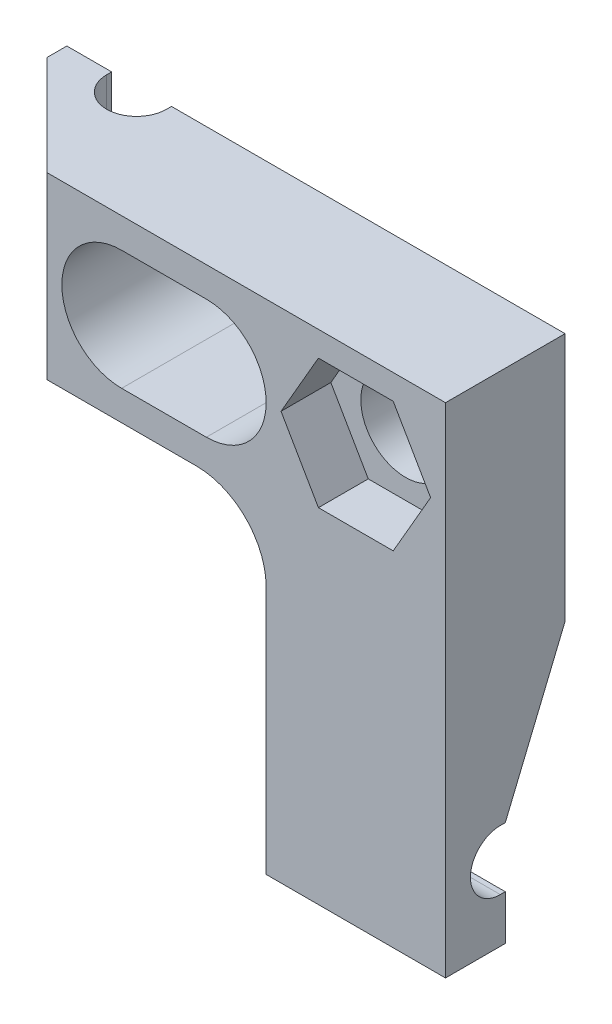
ISO-10303-21;
HEADER;
FILE_DESCRIPTION(('STEP AP214'),'2;1');
FILE_NAME('part.step','',(''),(''),'','','');
FILE_SCHEMA(('AUTOMOTIVE_DESIGN { 1 0 10303 214 1 1 1 1 }'));
ENDSEC;
DATA;
#1=APPLICATION_CONTEXT('core data for automotive mechanical design processes');
#2=APPLICATION_PROTOCOL_DEFINITION('international standard','automotive_design',2000,#1);
#3=PRODUCT_CONTEXT('',#1,'mechanical');
#4=PRODUCT('Part','Part','',(#3));
#5=PRODUCT_RELATED_PRODUCT_CATEGORY('part','',(#4));
#6=PRODUCT_DEFINITION_FORMATION('','',#4);
#7=PRODUCT_DEFINITION_CONTEXT('part definition',#1,'design');
#8=PRODUCT_DEFINITION('design','',#6,#7);
#9=PRODUCT_DEFINITION_SHAPE('','',#8);
#10=(LENGTH_UNIT() NAMED_UNIT(*) SI_UNIT(.MILLI.,.METRE.));
#11=(NAMED_UNIT(*) PLANE_ANGLE_UNIT() SI_UNIT($,.RADIAN.));
#12=(NAMED_UNIT(*) SI_UNIT($,.STERADIAN.) SOLID_ANGLE_UNIT());
#13=UNCERTAINTY_MEASURE_WITH_UNIT(LENGTH_MEASURE(1.E-05),#10,'distance_accuracy_value','');
#14=(GEOMETRIC_REPRESENTATION_CONTEXT(3) GLOBAL_UNCERTAINTY_ASSIGNED_CONTEXT((#13)) GLOBAL_UNIT_ASSIGNED_CONTEXT((#10,
#11,#12)) REPRESENTATION_CONTEXT('',''));
#15=CARTESIAN_POINT('',(0.,0.,0.));
#16=DIRECTION('',(0.,0.,1.));
#17=DIRECTION('',(1.,0.,0.));
#18=AXIS2_PLACEMENT_3D('',#15,#16,#17);
#19=CARTESIAN_POINT('',(42.5,17.5,6.));
#20=DIRECTION('',(0.,0.,1.));
#21=DIRECTION('',(1.,0.,0.));
#22=AXIS2_PLACEMENT_3D('',#19,#20,#21);
#23=PLANE('',#22);
#24=DIRECTION('',(-1.,0.,0.));
#25=VECTOR('',#24,1.);
#26=CARTESIAN_POINT('',(42.5,3.,6.));
#27=LINE('',#26,#25);
#28=CARTESIAN_POINT('',(39.5,3.,6.));
#29=VERTEX_POINT('',#28);
#30=CARTESIAN_POINT('',(27.5,3.,6.));
#31=VERTEX_POINT('',#30);
#32=EDGE_CURVE('E303',#29,#31,#27,.T.);
#33=ORIENTED_EDGE('',*,*,#32,.T.);
#34=DIRECTION('',(0.,1.,0.));
#35=VECTOR('',#34,1.);
#36=CARTESIAN_POINT('',(27.5,3.,6.));
#37=LINE('',#36,#35);
#38=CARTESIAN_POINT('',(27.5,17.5,6.));
#39=VERTEX_POINT('',#38);
#40=EDGE_CURVE('E270',#31,#39,#37,.T.);
#41=ORIENTED_EDGE('',*,*,#40,.T.);
#42=DIRECTION('',(1.,0.,0.));
#43=VECTOR('',#42,1.);
#44=CARTESIAN_POINT('',(42.5,17.5,6.));
#45=LINE('',#44,#43);
#46=CARTESIAN_POINT('',(39.5,17.5,6.));
#47=VERTEX_POINT('',#46);
#48=EDGE_CURVE('E301',#39,#47,#45,.T.);
#49=ORIENTED_EDGE('',*,*,#48,.T.);
#50=DIRECTION('',(0.,-1.,0.));
#51=VECTOR('',#50,1.);
#52=CARTESIAN_POINT('',(39.5,3.,6.));
#53=LINE('',#52,#51);
#54=EDGE_CURVE('E286',#47,#29,#53,.T.);
#55=ORIENTED_EDGE('',*,*,#54,.T.);
#56=EDGE_LOOP('',(#33,#41,#49,#55));
#57=FACE_BOUND('',#56,.T.);
#58=ADVANCED_FACE('F31',(#57),#23,.F.);
#59=CARTESIAN_POINT('',(42.5,17.5,6.));
#60=DIRECTION('',(0.,1.,0.));
#61=DIRECTION('',(0.,0.,1.));
#62=AXIS2_PLACEMENT_3D('',#59,#60,#61);
#63=PLANE('',#62);
#64=ORIENTED_EDGE('',*,*,#48,.F.);
#65=DIRECTION('',(0.,0.,-1.));
#66=VECTOR('',#65,1.);
#67=CARTESIAN_POINT('',(27.5,17.5,6.));
#68=LINE('',#67,#66);
#69=CARTESIAN_POINT('',(27.5,17.5,0.));
#70=VERTEX_POINT('',#69);
#71=EDGE_CURVE('E272',#39,#70,#68,.T.);
#72=ORIENTED_EDGE('',*,*,#71,.T.);
#73=DIRECTION('',(1.,0.,0.));
#74=VECTOR('',#73,1.);
#75=CARTESIAN_POINT('',(42.5,17.5,0.));
#76=LINE('',#75,#74);
#77=CARTESIAN_POINT('',(39.5,17.5,0.));
#78=VERTEX_POINT('',#77);
#79=EDGE_CURVE('E293',#70,#78,#76,.T.);
#80=ORIENTED_EDGE('',*,*,#79,.T.);
#81=DIRECTION('',(0.,0.,1.));
#82=VECTOR('',#81,1.);
#83=CARTESIAN_POINT('',(39.5,17.5,6.));
#84=LINE('',#83,#82);
#85=EDGE_CURVE('E283',#78,#47,#84,.T.);
#86=ORIENTED_EDGE('',*,*,#85,.T.);
#87=EDGE_LOOP('',(#64,#72,#80,#86));
#88=FACE_BOUND('',#87,.T.);
#89=ADVANCED_FACE('F501',(#88),#63,.F.);
#90=CARTESIAN_POINT('',(17.5,17.5,0.));
#91=DIRECTION('',(0.,0.,-1.));
#92=DIRECTION('',(-1.,0.,0.));
#93=AXIS2_PLACEMENT_3D('',#90,#91,#92);
#94=PLANE('',#93);
#95=CARTESIAN_POINT('',(18.5,33.5,0.));
#96=DIRECTION('',(0.,0.,-1.));
#97=DIRECTION('',(-1.,0.,0.));
#98=AXIS2_PLACEMENT_3D('',#95,#96,#97);
#99=CIRCLE('',#98,6.);
#100=CARTESIAN_POINT('',(18.5,39.5,0.));
#101=VERTEX_POINT('',#100);
#102=CARTESIAN_POINT('',(18.5,27.5,0.));
#103=VERTEX_POINT('',#102);
#104=EDGE_CURVE('E230',#101,#103,#99,.T.);
#105=ORIENTED_EDGE('',*,*,#104,.F.);
#106=DIRECTION('',(1.,0.,0.));
#107=VECTOR('',#106,1.);
#108=CARTESIAN_POINT('',(18.5,39.5,0.));
#109=LINE('',#108,#107);
#110=CARTESIAN_POINT('',(10.,39.5,0.));
#111=VERTEX_POINT('',#110);
#112=EDGE_CURVE('E248',#111,#101,#109,.T.);
#113=ORIENTED_EDGE('',*,*,#112,.F.);
#114=CARTESIAN_POINT('',(10.,33.5,0.));
#115=DIRECTION('',(0.,0.,-1.));
#116=DIRECTION('',(-1.,0.,0.));
#117=AXIS2_PLACEMENT_3D('',#114,#115,#116);
#118=CIRCLE('',#117,5.99999999999999);
#119=CARTESIAN_POINT('',(10.,27.5,0.));
#120=VERTEX_POINT('',#119);
#121=EDGE_CURVE('E251',#120,#111,#118,.T.);
#122=ORIENTED_EDGE('',*,*,#121,.F.);
#123=DIRECTION('',(-1.,0.,0.));
#124=VECTOR('',#123,1.);
#125=CARTESIAN_POINT('',(18.5,27.5,0.));
#126=LINE('',#125,#124);
#127=EDGE_CURVE('E257',#103,#120,#126,.T.);
#128=ORIENTED_EDGE('',*,*,#127,.F.);
#129=EDGE_LOOP('',(#105,#113,#122,#128));
#130=FACE_BOUND('',#129,.T.);
#131=CARTESIAN_POINT('',(24.5,17.5,0.));
#132=VERTEX_POINT('',#131);
#133=EDGE_CURVE('E297',#132,#70,#76,.T.);
#134=ORIENTED_EDGE('',*,*,#133,.F.);
#135=CARTESIAN_POINT('',(17.5,17.5,0.));
#136=DIRECTION('',(0.,0.,-1.));
#137=DIRECTION('',(-1.,0.,0.));
#138=AXIS2_PLACEMENT_3D('',#135,#136,#137);
#139=CIRCLE('',#138,6.99999999999999);
#140=CARTESIAN_POINT('',(17.5,24.5,0.));
#141=VERTEX_POINT('',#140);
#142=EDGE_CURVE('E424',#141,#132,#139,.T.);
#143=ORIENTED_EDGE('',*,*,#142,.F.);
#144=DIRECTION('',(1.,0.,0.));
#145=VECTOR('',#144,1.);
#146=CARTESIAN_POINT('',(-7.5,24.5,0.));
#147=LINE('',#146,#145);
#148=CARTESIAN_POINT('',(3.,24.5,0.));
#149=VERTEX_POINT('',#148);
#150=EDGE_CURVE('E420',#149,#141,#147,.T.);
#151=ORIENTED_EDGE('',*,*,#150,.F.);
#152=DIRECTION('',(0.,1.,0.));
#153=VECTOR('',#152,1.);
#154=CARTESIAN_POINT('',(3.,17.5,0.));
#155=LINE('',#154,#153);
#156=CARTESIAN_POINT('',(3.,42.5,0.));
#157=VERTEX_POINT('',#156);
#158=EDGE_CURVE('E340',#149,#157,#155,.T.);
#159=ORIENTED_EDGE('',*,*,#158,.T.);
#160=DIRECTION('',(-1.,0.,0.));
#161=VECTOR('',#160,1.);
#162=CARTESIAN_POINT('',(-7.5,42.5,0.));
#163=LINE('',#162,#161);
#164=CARTESIAN_POINT('',(42.5,42.5,0.));
#165=VERTEX_POINT('',#164);
#166=EDGE_CURVE('E414',#165,#157,#163,.T.);
#167=ORIENTED_EDGE('',*,*,#166,.F.);
#168=DIRECTION('',(0.,1.,0.));
#169=VECTOR('',#168,1.);
#170=CARTESIAN_POINT('',(42.5,-7.50000000000001,0.));
#171=LINE('',#170,#169);
#172=CARTESIAN_POINT('',(42.5,17.5,0.));
#173=VERTEX_POINT('',#172);
#174=EDGE_CURVE('E403',#173,#165,#171,.T.);
#175=ORIENTED_EDGE('',*,*,#174,.F.);
#176=DIRECTION('',(1.,0.,0.));
#177=VECTOR('',#176,1.);
#178=CARTESIAN_POINT('',(39.5,17.5,0.));
#179=LINE('',#178,#177);
#180=EDGE_CURVE('E289',#78,#173,#179,.T.);
#181=ORIENTED_EDGE('',*,*,#180,.F.);
#182=ORIENTED_EDGE('',*,*,#79,.F.);
#183=EDGE_LOOP('',(#134,#143,#151,#159,#167,#175,#181,#182));
#184=FACE_BOUND('',#183,.T.);
#185=CARTESIAN_POINT('',(33.5,33.5,0.));
#186=DIRECTION('',(0.,0.,1.));
#187=DIRECTION('',(1.,0.,0.));
#188=AXIS2_PLACEMENT_3D('',#185,#186,#187);
#189=CIRCLE('',#188,4.5);
#190=CARTESIAN_POINT('',(38.,33.5,0.));
#191=VERTEX_POINT('',#190);
#192=EDGE_CURVE('E395',#191,#191,#189,.T.);
#193=ORIENTED_EDGE('',*,*,#192,.T.);
#194=EDGE_LOOP('',(#193));
#195=FACE_BOUND('',#194,.T.);
#196=ADVANCED_FACE('F508',(#130,#184,#195),#94,.T.);
#197=CARTESIAN_POINT('',(24.5,17.5,12.));
#198=DIRECTION('',(1.,0.,0.));
#199=DIRECTION('',(0.,1.,0.));
#200=AXIS2_PLACEMENT_3D('',#197,#198,#199);
#201=PLANE('',#200);
#202=DIRECTION('',(0.,0.,-1.));
#203=VECTOR('',#202,1.);
#204=CARTESIAN_POINT('',(24.5,17.5,12.));
#205=LINE('',#204,#203);
#206=CARTESIAN_POINT('',(24.5,17.5,12.));
#207=VERTEX_POINT('',#206);
#208=EDGE_CURVE('E436',#207,#132,#205,.T.);
#209=ORIENTED_EDGE('',*,*,#208,.T.);
#210=DIRECTION('',(0.,-0.924016832421891,0.3823517927263));
#211=VECTOR('',#210,1.);
#212=CARTESIAN_POINT('',(24.5,17.5,0.));
#213=LINE('',#212,#211);
#214=CARTESIAN_POINT('',(24.5,3.,6.));
#215=VERTEX_POINT('',#214);
#216=EDGE_CURVE('E263',#132,#215,#213,.T.);
#217=ORIENTED_EDGE('',*,*,#216,.T.);
#218=DIRECTION('',(0.,0.,-1.));
#219=VECTOR('',#218,1.);
#220=CARTESIAN_POINT('',(24.5,3.,12.));
#221=LINE('',#220,#219);
#222=CARTESIAN_POINT('',(24.5,3.,6.5));
#223=VERTEX_POINT('',#222);
#224=EDGE_CURVE('E326',#223,#215,#221,.T.);
#225=ORIENTED_EDGE('',*,*,#224,.F.);
#226=CARTESIAN_POINT('',(24.5,0.,6.5));
#227=DIRECTION('',(1.,0.,0.));
#228=DIRECTION('',(0.,1.,0.));
#229=AXIS2_PLACEMENT_3D('',#226,#227,#228);
#230=CIRCLE('',#229,3.);
#231=CARTESIAN_POINT('',(24.5,-3.,6.5));
#232=VERTEX_POINT('',#231);
#233=EDGE_CURVE('E324',#232,#223,#230,.F.);
#234=ORIENTED_EDGE('',*,*,#233,.F.);
#235=DIRECTION('',(0.,0.,1.));
#236=VECTOR('',#235,1.);
#237=CARTESIAN_POINT('',(24.5,-3.,12.));
#238=LINE('',#237,#236);
#239=CARTESIAN_POINT('',(24.5,-3.,6.));
#240=VERTEX_POINT('',#239);
#241=EDGE_CURVE('E322',#240,#232,#238,.T.);
#242=ORIENTED_EDGE('',*,*,#241,.F.);
#243=DIRECTION('',(0.,1.,0.));
#244=VECTOR('',#243,1.);
#245=CARTESIAN_POINT('',(24.5,-7.50000000000001,6.));
#246=LINE('',#245,#244);
#247=CARTESIAN_POINT('',(24.5,-7.50000000000001,6.));
#248=VERTEX_POINT('',#247);
#249=EDGE_CURVE('E299',#248,#240,#246,.T.);
#250=ORIENTED_EDGE('',*,*,#249,.F.);
#251=DIRECTION('',(0.,0.,-1.));
#252=VECTOR('',#251,1.);
#253=CARTESIAN_POINT('',(24.5,-7.50000000000001,12.));
#254=LINE('',#253,#252);
#255=CARTESIAN_POINT('',(24.5,-7.50000000000001,12.));
#256=VERTEX_POINT('',#255);
#257=EDGE_CURVE('E433',#256,#248,#254,.T.);
#258=ORIENTED_EDGE('',*,*,#257,.F.);
#259=DIRECTION('',(0.,-1.,0.));
#260=VECTOR('',#259,1.);
#261=CARTESIAN_POINT('',(24.5,17.5,12.));
#262=LINE('',#261,#260);
#263=EDGE_CURVE('E407',#207,#256,#262,.T.);
#264=ORIENTED_EDGE('',*,*,#263,.F.);
#265=EDGE_LOOP('',(#209,#217,#225,#234,#242,#250,#258,#264));
#266=FACE_BOUND('',#265,.T.);
#267=ADVANCED_FACE('F478',(#266),#201,.F.);
#268=CARTESIAN_POINT('',(42.5,-7.50000000000001,12.));
#269=DIRECTION('',(-1.,0.,0.));
#270=DIRECTION('',(0.,-1.,0.));
#271=AXIS2_PLACEMENT_3D('',#268,#269,#270);
#272=PLANE('',#271);
#273=DIRECTION('',(0.,0.,1.));
#274=VECTOR('',#273,1.);
#275=CARTESIAN_POINT('',(42.5,3.,0.500000000000001));
#276=LINE('',#275,#274);
#277=CARTESIAN_POINT('',(42.5,3.,6.));
#278=VERTEX_POINT('',#277);
#279=CARTESIAN_POINT('',(42.5,3.,6.5));
#280=VERTEX_POINT('',#279);
#281=EDGE_CURVE('E308',#278,#280,#276,.T.);
#282=ORIENTED_EDGE('',*,*,#281,.F.);
#283=DIRECTION('',(0.,0.924016832421891,-0.3823517927263));
#284=VECTOR('',#283,1.);
#285=CARTESIAN_POINT('',(42.5,17.5,0.));
#286=LINE('',#285,#284);
#287=EDGE_CURVE('E279',#278,#173,#286,.T.);
#288=ORIENTED_EDGE('',*,*,#287,.T.);
#289=ORIENTED_EDGE('',*,*,#174,.T.);
#290=DIRECTION('',(0.,0.,-1.));
#291=VECTOR('',#290,1.);
#292=CARTESIAN_POINT('',(42.5,42.5,12.));
#293=LINE('',#292,#291);
#294=CARTESIAN_POINT('',(42.5,42.5,12.));
#295=VERTEX_POINT('',#294);
#296=EDGE_CURVE('E413',#295,#165,#293,.T.);
#297=ORIENTED_EDGE('',*,*,#296,.F.);
#298=DIRECTION('',(0.,1.,0.));
#299=VECTOR('',#298,1.);
#300=CARTESIAN_POINT('',(42.5,-7.50000000000001,12.));
#301=LINE('',#300,#299);
#302=CARTESIAN_POINT('',(42.5,-7.50000000000001,12.));
#303=VERTEX_POINT('',#302);
#304=EDGE_CURVE('E411',#303,#295,#301,.T.);
#305=ORIENTED_EDGE('',*,*,#304,.F.);
#306=DIRECTION('',(0.,0.,-1.));
#307=VECTOR('',#306,1.);
#308=CARTESIAN_POINT('',(42.5,-7.50000000000001,12.));
#309=LINE('',#308,#307);
#310=CARTESIAN_POINT('',(42.5,-7.50000000000001,6.));
#311=VERTEX_POINT('',#310);
#312=EDGE_CURVE('E430',#303,#311,#309,.T.);
#313=ORIENTED_EDGE('',*,*,#312,.T.);
#314=DIRECTION('',(0.,-1.,0.));
#315=VECTOR('',#314,1.);
#316=CARTESIAN_POINT('',(42.5,-7.50000000000001,6.));
#317=LINE('',#316,#315);
#318=CARTESIAN_POINT('',(42.5,-3.,6.));
#319=VERTEX_POINT('',#318);
#320=EDGE_CURVE('E294',#319,#311,#317,.T.);
#321=ORIENTED_EDGE('',*,*,#320,.F.);
#322=DIRECTION('',(0.,0.,-1.));
#323=VECTOR('',#322,1.);
#324=CARTESIAN_POINT('',(42.5,-3.,0.5));
#325=LINE('',#324,#323);
#326=CARTESIAN_POINT('',(42.5,-3.,6.5));
#327=VERTEX_POINT('',#326);
#328=EDGE_CURVE('E313',#327,#319,#325,.T.);
#329=ORIENTED_EDGE('',*,*,#328,.F.);
#330=CARTESIAN_POINT('',(42.5,0.,6.5));
#331=DIRECTION('',(1.,0.,0.));
#332=DIRECTION('',(0.,0.,-1.));
#333=AXIS2_PLACEMENT_3D('',#330,#331,#332);
#334=CIRCLE('',#333,3.);
#335=EDGE_CURVE('E310',#280,#327,#334,.T.);
#336=ORIENTED_EDGE('',*,*,#335,.F.);
#337=EDGE_LOOP('',(#282,#288,#289,#297,#305,#313,#321,#329,#336));
#338=FACE_BOUND('',#337,.T.);
#339=ADVANCED_FACE('F488',(#338),#272,.F.);
#340=CARTESIAN_POINT('',(-3.,42.5,0.));
#341=VERTEX_POINT('',#340);
#342=CARTESIAN_POINT('',(-7.5,42.5,0.));
#343=VERTEX_POINT('',#342);
#344=EDGE_CURVE('E398',#341,#343,#163,.T.);
#345=ORIENTED_EDGE('',*,*,#344,.F.);
#346=DIRECTION('',(0.,-1.,0.));
#347=VECTOR('',#346,1.);
#348=CARTESIAN_POINT('',(-3.,17.5,0.));
#349=LINE('',#348,#347);
#350=CARTESIAN_POINT('',(-3.,24.5,0.));
#351=VERTEX_POINT('',#350);
#352=EDGE_CURVE('E343',#341,#351,#349,.T.);
#353=ORIENTED_EDGE('',*,*,#352,.T.);
#354=CARTESIAN_POINT('',(-7.5,24.5,0.));
#355=VERTEX_POINT('',#354);
#356=EDGE_CURVE('E421',#355,#351,#147,.T.);
#357=ORIENTED_EDGE('',*,*,#356,.F.);
#358=DIRECTION('',(0.,-1.,0.));
#359=VECTOR('',#358,1.);
#360=CARTESIAN_POINT('',(-7.5,42.5,0.));
#361=LINE('',#360,#359);
#362=EDGE_CURVE('E417',#343,#355,#361,.T.);
#363=ORIENTED_EDGE('',*,*,#362,.F.);
#364=EDGE_LOOP('',(#345,#353,#357,#363));
#365=FACE_BOUND('',#364,.T.);
#366=ADVANCED_FACE('F571',(#365),#94,.T.);
#367=CARTESIAN_POINT('',(-7.5,42.5,12.));
#368=DIRECTION('',(0.,-1.,0.));
#369=DIRECTION('',(0.,0.,-1.));
#370=AXIS2_PLACEMENT_3D('',#367,#368,#369);
#371=PLANE('',#370);
#372=DIRECTION('',(0.,0.,-1.));
#373=VECTOR('',#372,1.);
#374=CARTESIAN_POINT('',(-7.5,42.5,12.));
#375=LINE('',#374,#373);
#376=CARTESIAN_POINT('',(-7.5,42.5,1.99999999999997));
#377=VERTEX_POINT('',#376);
#378=EDGE_CURVE('E443',#377,#343,#375,.T.);
#379=ORIENTED_EDGE('',*,*,#378,.F.);
#380=DIRECTION('',(-0.707106781186546,0.,-0.707106781186549));
#381=VECTOR('',#380,1.);
#382=CARTESIAN_POINT('',(2.49999999999999,42.5,12.));
#383=LINE('',#382,#381);
#384=CARTESIAN_POINT('',(2.49999999999999,42.5,12.));
#385=VERTEX_POINT('',#384);
#386=EDGE_CURVE('E11',#377,#385,#383,.F.);
#387=ORIENTED_EDGE('',*,*,#386,.T.);
#388=DIRECTION('',(-1.,0.,0.));
#389=VECTOR('',#388,1.);
#390=CARTESIAN_POINT('',(-7.5,42.5,12.));
#391=LINE('',#390,#389);
#392=EDGE_CURVE('E399',#295,#385,#391,.T.);
#393=ORIENTED_EDGE('',*,*,#392,.F.);
#394=ORIENTED_EDGE('',*,*,#296,.T.);
#395=ORIENTED_EDGE('',*,*,#166,.T.);
#396=DIRECTION('',(0.,0.,-1.));
#397=VECTOR('',#396,1.);
#398=CARTESIAN_POINT('',(3.,42.5,-4.57695125411553));
#399=LINE('',#398,#397);
#400=CARTESIAN_POINT('',(3.,42.5,0.5));
#401=VERTEX_POINT('',#400);
#402=EDGE_CURVE('E332',#401,#157,#399,.T.);
#403=ORIENTED_EDGE('',*,*,#402,.F.);
#404=CARTESIAN_POINT('',(0.,42.5,0.5));
#405=DIRECTION('',(0.,1.,0.));
#406=DIRECTION('',(0.,0.,1.));
#407=AXIS2_PLACEMENT_3D('',#404,#405,#406);
#408=CIRCLE('',#407,3.);
#409=CARTESIAN_POINT('',(-3.,42.5,0.499999999999999));
#410=VERTEX_POINT('',#409);
#411=EDGE_CURVE('E330',#410,#401,#408,.T.);
#412=ORIENTED_EDGE('',*,*,#411,.F.);
#413=DIRECTION('',(0.,0.,1.));
#414=VECTOR('',#413,1.);
#415=CARTESIAN_POINT('',(-3.,42.5,-4.57695125411553));
#416=LINE('',#415,#414);
#417=EDGE_CURVE('E328',#341,#410,#416,.T.);
#418=ORIENTED_EDGE('',*,*,#417,.F.);
#419=ORIENTED_EDGE('',*,*,#344,.T.);
#420=EDGE_LOOP('',(#379,#387,#393,#394,#395,#403,#412,#418,#419));
#421=FACE_BOUND('',#420,.T.);
#422=ADVANCED_FACE('F492',(#421),#371,.F.);
#423=CARTESIAN_POINT('',(-7.5,24.5,12.));
#424=DIRECTION('',(0.,1.,0.));
#425=DIRECTION('',(0.,0.,1.));
#426=AXIS2_PLACEMENT_3D('',#423,#424,#425);
#427=PLANE('',#426);
#428=DIRECTION('',(1.,0.,0.));
#429=VECTOR('',#428,1.);
#430=CARTESIAN_POINT('',(-7.5,24.5,12.));
#431=LINE('',#430,#429);
#432=CARTESIAN_POINT('',(2.49999999999999,24.5,12.));
#433=VERTEX_POINT('',#432);
#434=CARTESIAN_POINT('',(17.5,24.5,12.));
#435=VERTEX_POINT('',#434);
#436=EDGE_CURVE('E402',#433,#435,#431,.T.);
#437=ORIENTED_EDGE('',*,*,#436,.F.);
#438=DIRECTION('',(0.707106781186546,0.,0.707106781186549));
#439=VECTOR('',#438,1.);
#440=CARTESIAN_POINT('',(2.49999999999999,24.5,12.));
#441=LINE('',#440,#439);
#442=CARTESIAN_POINT('',(-7.5,24.5,1.99999999999998));
#443=VERTEX_POINT('',#442);
#444=EDGE_CURVE('E53',#433,#443,#441,.F.);
#445=ORIENTED_EDGE('',*,*,#444,.T.);
#446=DIRECTION('',(0.,0.,-1.));
#447=VECTOR('',#446,1.);
#448=CARTESIAN_POINT('',(-7.5,24.5,12.));
#449=LINE('',#448,#447);
#450=EDGE_CURVE('E441',#443,#355,#449,.T.);
#451=ORIENTED_EDGE('',*,*,#450,.T.);
#452=ORIENTED_EDGE('',*,*,#356,.T.);
#453=DIRECTION('',(0.,0.,-1.));
#454=VECTOR('',#453,1.);
#455=CARTESIAN_POINT('',(-3.,24.5,12.));
#456=LINE('',#455,#454);
#457=CARTESIAN_POINT('',(-3.,24.5,0.499999999999999));
#458=VERTEX_POINT('',#457);
#459=EDGE_CURVE('E451',#458,#351,#456,.T.);
#460=ORIENTED_EDGE('',*,*,#459,.F.);
#461=CARTESIAN_POINT('',(0.,24.5,0.5));
#462=DIRECTION('',(0.,1.,0.));
#463=DIRECTION('',(0.,0.,1.));
#464=AXIS2_PLACEMENT_3D('',#461,#462,#463);
#465=CIRCLE('',#464,3.);
#466=CARTESIAN_POINT('',(3.,24.5,0.5));
#467=VERTEX_POINT('',#466);
#468=EDGE_CURVE('E449',#467,#458,#465,.F.);
#469=ORIENTED_EDGE('',*,*,#468,.F.);
#470=DIRECTION('',(0.,0.,1.));
#471=VECTOR('',#470,1.);
#472=CARTESIAN_POINT('',(3.,24.5,12.));
#473=LINE('',#472,#471);
#474=EDGE_CURVE('E445',#149,#467,#473,.T.);
#475=ORIENTED_EDGE('',*,*,#474,.F.);
#476=ORIENTED_EDGE('',*,*,#150,.T.);
#477=DIRECTION('',(0.,0.,-1.));
#478=VECTOR('',#477,1.);
#479=CARTESIAN_POINT('',(17.5,24.5,12.));
#480=LINE('',#479,#478);
#481=EDGE_CURVE('E438',#435,#141,#480,.T.);
#482=ORIENTED_EDGE('',*,*,#481,.F.);
#483=EDGE_LOOP('',(#437,#445,#451,#452,#460,#469,#475,#476,#482));
#484=FACE_BOUND('',#483,.T.);
#485=ADVANCED_FACE('F464',(#484),#427,.F.);
#486=CARTESIAN_POINT('',(33.5,33.5,12.));
#487=DIRECTION('',(0.,0.,-1.));
#488=DIRECTION('',(-1.,0.,0.));
#489=AXIS2_PLACEMENT_3D('',#486,#487,#488);
#490=CYLINDRICAL_SURFACE('',#489,4.5);
#491=ORIENTED_EDGE('',*,*,#192,.F.);
#492=EDGE_LOOP('',(#491));
#493=FACE_BOUND('',#492,.T.);
#494=CARTESIAN_POINT('',(33.5,33.5,7.));
#495=DIRECTION('',(0.,0.,1.));
#496=DIRECTION('',(1.,0.,0.));
#497=AXIS2_PLACEMENT_3D('',#494,#495,#496);
#498=CIRCLE('',#497,4.5);
#499=CARTESIAN_POINT('',(38.,33.5,7.));
#500=VERTEX_POINT('',#499);
#501=EDGE_CURVE('E384',#500,#500,#498,.T.);
#502=ORIENTED_EDGE('',*,*,#501,.T.);
#503=EDGE_LOOP('',(#502));
#504=FACE_BOUND('',#503,.T.);
#505=ADVANCED_FACE('F581',(#493,#504),#490,.F.);
#506=CARTESIAN_POINT('',(17.5,17.5,12.));
#507=DIRECTION('',(0.,0.,-1.));
#508=DIRECTION('',(-1.,0.,0.));
#509=AXIS2_PLACEMENT_3D('',#506,#507,#508);
#510=PLANE('',#509);
#511=DIRECTION('',(1.,0.,0.));
#512=VECTOR('',#511,1.);
#513=CARTESIAN_POINT('',(18.5,39.5,12.));
#514=LINE('',#513,#512);
#515=CARTESIAN_POINT('',(10.,39.5,12.));
#516=VERTEX_POINT('',#515);
#517=CARTESIAN_POINT('',(18.5,39.5,12.));
#518=VERTEX_POINT('',#517);
#519=EDGE_CURVE('E235',#516,#518,#514,.T.);
#520=ORIENTED_EDGE('',*,*,#519,.T.);
#521=CARTESIAN_POINT('',(18.5,33.5,12.));
#522=DIRECTION('',(0.,0.,-1.));
#523=DIRECTION('',(-1.,0.,0.));
#524=AXIS2_PLACEMENT_3D('',#521,#522,#523);
#525=CIRCLE('',#524,6.);
#526=CARTESIAN_POINT('',(18.5,27.5,12.));
#527=VERTEX_POINT('',#526);
#528=EDGE_CURVE('E227',#518,#527,#525,.T.);
#529=ORIENTED_EDGE('',*,*,#528,.T.);
#530=DIRECTION('',(-1.,0.,0.));
#531=VECTOR('',#530,1.);
#532=CARTESIAN_POINT('',(18.5,27.5,12.));
#533=LINE('',#532,#531);
#534=CARTESIAN_POINT('',(10.,27.5,12.));
#535=VERTEX_POINT('',#534);
#536=EDGE_CURVE('E239',#527,#535,#533,.T.);
#537=ORIENTED_EDGE('',*,*,#536,.T.);
#538=CARTESIAN_POINT('',(10.,33.5,12.));
#539=DIRECTION('',(0.,0.,-1.));
#540=DIRECTION('',(-1.,0.,0.));
#541=AXIS2_PLACEMENT_3D('',#538,#539,#540);
#542=CIRCLE('',#541,5.99999999999999);
#543=EDGE_CURVE('E243',#535,#516,#542,.T.);
#544=ORIENTED_EDGE('',*,*,#543,.T.);
#545=EDGE_LOOP('',(#520,#529,#537,#544));
#546=FACE_BOUND('',#545,.T.);
#547=DIRECTION('',(-0.499999999999998,0.86602540378444,0.));
#548=VECTOR('',#547,1.);
#549=CARTESIAN_POINT('',(41.0055534994651,33.5,12.));
#550=LINE('',#549,#548);
#551=CARTESIAN_POINT('',(41.0055534994651,33.5,12.));
#552=VERTEX_POINT('',#551);
#553=CARTESIAN_POINT('',(37.2527767497326,40.,12.));
#554=VERTEX_POINT('',#553);
#555=EDGE_CURVE('E368',#552,#554,#550,.T.);
#556=ORIENTED_EDGE('',*,*,#555,.F.);
#557=DIRECTION('',(0.5,0.866025403784438,0.));
#558=VECTOR('',#557,1.);
#559=CARTESIAN_POINT('',(37.2527767497325,27.,12.));
#560=LINE('',#559,#558);
#561=CARTESIAN_POINT('',(37.2527767497325,27.,12.));
#562=VERTEX_POINT('',#561);
#563=EDGE_CURVE('E346',#562,#552,#560,.T.);
#564=ORIENTED_EDGE('',*,*,#563,.F.);
#565=DIRECTION('',(1.,0.,0.));
#566=VECTOR('',#565,1.);
#567=CARTESIAN_POINT('',(29.7472232502674,27.,12.));
#568=LINE('',#567,#566);
#569=CARTESIAN_POINT('',(29.7472232502674,27.,12.));
#570=VERTEX_POINT('',#569);
#571=EDGE_CURVE('E351',#570,#562,#568,.T.);
#572=ORIENTED_EDGE('',*,*,#571,.F.);
#573=DIRECTION('',(0.499999999999998,-0.86602540378444,0.));
#574=VECTOR('',#573,1.);
#575=CARTESIAN_POINT('',(25.9944465005349,33.5,12.));
#576=LINE('',#575,#574);
#577=CARTESIAN_POINT('',(25.9944465005349,33.5,12.));
#578=VERTEX_POINT('',#577);
#579=EDGE_CURVE('E377',#578,#570,#576,.T.);
#580=ORIENTED_EDGE('',*,*,#579,.F.);
#581=DIRECTION('',(-0.500000000000003,-0.866025403784437,0.));
#582=VECTOR('',#581,1.);
#583=CARTESIAN_POINT('',(29.7472232502675,40.,12.));
#584=LINE('',#583,#582);
#585=CARTESIAN_POINT('',(29.7472232502675,40.,12.));
#586=VERTEX_POINT('',#585);
#587=EDGE_CURVE('E374',#586,#578,#584,.T.);
#588=ORIENTED_EDGE('',*,*,#587,.F.);
#589=DIRECTION('',(-1.,0.,0.));
#590=VECTOR('',#589,1.);
#591=CARTESIAN_POINT('',(37.2527767497326,40.,12.));
#592=LINE('',#591,#590);
#593=EDGE_CURVE('E371',#554,#586,#592,.T.);
#594=ORIENTED_EDGE('',*,*,#593,.F.);
#595=EDGE_LOOP('',(#556,#564,#572,#580,#588,#594));
#596=FACE_BOUND('',#595,.T.);
#597=ORIENTED_EDGE('',*,*,#392,.T.);
#598=DIRECTION('',(0.,-1.,0.));
#599=VECTOR('',#598,1.);
#600=CARTESIAN_POINT('',(2.49999999999999,17.5,12.));
#601=LINE('',#600,#599);
#602=EDGE_CURVE('E455',#385,#433,#601,.T.);
#603=ORIENTED_EDGE('',*,*,#602,.T.);
#604=ORIENTED_EDGE('',*,*,#436,.T.);
#605=CARTESIAN_POINT('',(17.5,17.5,12.));
#606=DIRECTION('',(0.,0.,-1.));
#607=DIRECTION('',(-1.,0.,0.));
#608=AXIS2_PLACEMENT_3D('',#605,#606,#607);
#609=CIRCLE('',#608,6.99999999999999);
#610=EDGE_CURVE('E405',#435,#207,#609,.T.);
#611=ORIENTED_EDGE('',*,*,#610,.T.);
#612=ORIENTED_EDGE('',*,*,#263,.T.);
#613=DIRECTION('',(1.,0.,0.));
#614=VECTOR('',#613,1.);
#615=CARTESIAN_POINT('',(24.5,-7.50000000000001,12.));
#616=LINE('',#615,#614);
#617=EDGE_CURVE('E409',#256,#303,#616,.T.);
#618=ORIENTED_EDGE('',*,*,#617,.T.);
#619=ORIENTED_EDGE('',*,*,#304,.T.);
#620=EDGE_LOOP('',(#597,#603,#604,#611,#612,#618,#619));
#621=FACE_BOUND('',#620,.T.);
#622=ADVANCED_FACE('F245',(#546,#596,#621),#510,.F.);
#623=CARTESIAN_POINT('',(-7.5,42.5,12.));
#624=DIRECTION('',(1.,0.,0.));
#625=DIRECTION('',(0.,1.,0.));
#626=AXIS2_PLACEMENT_3D('',#623,#624,#625);
#627=PLANE('',#626);
#628=ORIENTED_EDGE('',*,*,#450,.F.);
#629=DIRECTION('',(0.,1.,0.));
#630=VECTOR('',#629,1.);
#631=CARTESIAN_POINT('',(-7.5,42.5,1.99999999999998));
#632=LINE('',#631,#630);
#633=EDGE_CURVE('E39',#443,#377,#632,.T.);
#634=ORIENTED_EDGE('',*,*,#633,.T.);
#635=ORIENTED_EDGE('',*,*,#378,.T.);
#636=ORIENTED_EDGE('',*,*,#362,.T.);
#637=EDGE_LOOP('',(#628,#634,#635,#636));
#638=FACE_BOUND('',#637,.T.);
#639=ADVANCED_FACE('F573',(#638),#627,.F.);
#640=CARTESIAN_POINT('',(17.5,17.5,12.));
#641=DIRECTION('',(0.,0.,-1.));
#642=DIRECTION('',(-1.,0.,0.));
#643=AXIS2_PLACEMENT_3D('',#640,#641,#642);
#644=CYLINDRICAL_SURFACE('',#643,6.99999999999999);
#645=ORIENTED_EDGE('',*,*,#142,.T.);
#646=ORIENTED_EDGE('',*,*,#208,.F.);
#647=ORIENTED_EDGE('',*,*,#610,.F.);
#648=ORIENTED_EDGE('',*,*,#481,.T.);
#649=EDGE_LOOP('',(#645,#646,#647,#648));
#650=FACE_BOUND('',#649,.T.);
#651=ADVANCED_FACE('F471',(#650),#644,.F.);
#652=CARTESIAN_POINT('',(24.5,-7.50000000000001,12.));
#653=DIRECTION('',(0.,1.,0.));
#654=DIRECTION('',(0.,0.,1.));
#655=AXIS2_PLACEMENT_3D('',#652,#653,#654);
#656=PLANE('',#655);
#657=ORIENTED_EDGE('',*,*,#257,.T.);
#658=DIRECTION('',(-1.,0.,0.));
#659=VECTOR('',#658,1.);
#660=CARTESIAN_POINT('',(42.5,-7.50000000000001,6.));
#661=LINE('',#660,#659);
#662=EDGE_CURVE('E296',#311,#248,#661,.T.);
#663=ORIENTED_EDGE('',*,*,#662,.F.);
#664=ORIENTED_EDGE('',*,*,#312,.F.);
#665=ORIENTED_EDGE('',*,*,#617,.F.);
#666=EDGE_LOOP('',(#657,#663,#664,#665));
#667=FACE_BOUND('',#666,.T.);
#668=ADVANCED_FACE('F482',(#667),#656,.F.);
#669=CARTESIAN_POINT('',(37.2527767497325,27.,7.));
#670=DIRECTION('',(0.866025403784438,-0.5,0.));
#671=DIRECTION('',(0.5,0.866025403784438,0.));
#672=AXIS2_PLACEMENT_3D('',#669,#670,#671);
#673=PLANE('',#672);
#674=ORIENTED_EDGE('',*,*,#563,.T.);
#675=DIRECTION('',(0.,0.,1.));
#676=VECTOR('',#675,1.);
#677=CARTESIAN_POINT('',(41.0055534994651,33.5,7.));
#678=LINE('',#677,#676);
#679=CARTESIAN_POINT('',(41.0055534994651,33.5,7.));
#680=VERTEX_POINT('',#679);
#681=EDGE_CURVE('E366',#680,#552,#678,.T.);
#682=ORIENTED_EDGE('',*,*,#681,.F.);
#683=DIRECTION('',(0.5,0.866025403784438,0.));
#684=VECTOR('',#683,1.);
#685=CARTESIAN_POINT('',(37.2527767497325,27.,7.));
#686=LINE('',#685,#684);
#687=CARTESIAN_POINT('',(37.2527767497325,27.,7.));
#688=VERTEX_POINT('',#687);
#689=EDGE_CURVE('E347',#688,#680,#686,.T.);
#690=ORIENTED_EDGE('',*,*,#689,.F.);
#691=DIRECTION('',(0.,0.,1.));
#692=VECTOR('',#691,1.);
#693=CARTESIAN_POINT('',(37.2527767497325,27.,7.));
#694=LINE('',#693,#692);
#695=EDGE_CURVE('E382',#688,#562,#694,.T.);
#696=ORIENTED_EDGE('',*,*,#695,.T.);
#697=EDGE_LOOP('',(#674,#682,#690,#696));
#698=FACE_BOUND('',#697,.T.);
#699=ADVANCED_FACE('F697',(#698),#673,.F.);
#700=CARTESIAN_POINT('',(29.7472232502674,27.,7.));
#701=DIRECTION('',(0.,-1.,0.));
#702=DIRECTION('',(1.,0.,0.));
#703=AXIS2_PLACEMENT_3D('',#700,#701,#702);
#704=PLANE('',#703);
#705=ORIENTED_EDGE('',*,*,#571,.T.);
#706=ORIENTED_EDGE('',*,*,#695,.F.);
#707=DIRECTION('',(1.,0.,0.));
#708=VECTOR('',#707,1.);
#709=CARTESIAN_POINT('',(29.7472232502674,27.,7.));
#710=LINE('',#709,#708);
#711=CARTESIAN_POINT('',(29.7472232502674,27.,7.));
#712=VERTEX_POINT('',#711);
#713=EDGE_CURVE('E363',#712,#688,#710,.T.);
#714=ORIENTED_EDGE('',*,*,#713,.F.);
#715=DIRECTION('',(0.,0.,1.));
#716=VECTOR('',#715,1.);
#717=CARTESIAN_POINT('',(29.7472232502674,27.,7.));
#718=LINE('',#717,#716);
#719=EDGE_CURVE('E385',#712,#570,#718,.T.);
#720=ORIENTED_EDGE('',*,*,#719,.T.);
#721=EDGE_LOOP('',(#705,#706,#714,#720));
#722=FACE_BOUND('',#721,.T.);
#723=ADVANCED_FACE('F714',(#722),#704,.F.);
#724=CARTESIAN_POINT('',(25.9944465005349,33.5,7.));
#725=DIRECTION('',(-0.86602540378444,-0.499999999999998,0.));
#726=DIRECTION('',(0.499999999999998,-0.86602540378444,0.));
#727=AXIS2_PLACEMENT_3D('',#724,#725,#726);
#728=PLANE('',#727);
#729=ORIENTED_EDGE('',*,*,#579,.T.);
#730=ORIENTED_EDGE('',*,*,#719,.F.);
#731=DIRECTION('',(0.499999999999998,-0.86602540378444,0.));
#732=VECTOR('',#731,1.);
#733=CARTESIAN_POINT('',(25.9944465005349,33.5,7.));
#734=LINE('',#733,#732);
#735=CARTESIAN_POINT('',(25.9944465005349,33.5,7.));
#736=VERTEX_POINT('',#735);
#737=EDGE_CURVE('E360',#736,#712,#734,.T.);
#738=ORIENTED_EDGE('',*,*,#737,.F.);
#739=DIRECTION('',(0.,0.,1.));
#740=VECTOR('',#739,1.);
#741=CARTESIAN_POINT('',(25.9944465005349,33.5,7.));
#742=LINE('',#741,#740);
#743=EDGE_CURVE('E387',#736,#578,#742,.T.);
#744=ORIENTED_EDGE('',*,*,#743,.T.);
#745=EDGE_LOOP('',(#729,#730,#738,#744));
#746=FACE_BOUND('',#745,.T.);
#747=ADVANCED_FACE('F723',(#746),#728,.F.);
#748=CARTESIAN_POINT('',(29.7472232502675,40.,7.));
#749=DIRECTION('',(-0.866025403784437,0.500000000000003,0.));
#750=DIRECTION('',(-0.500000000000003,-0.866025403784437,0.));
#751=AXIS2_PLACEMENT_3D('',#748,#749,#750);
#752=PLANE('',#751);
#753=ORIENTED_EDGE('',*,*,#587,.T.);
#754=ORIENTED_EDGE('',*,*,#743,.F.);
#755=DIRECTION('',(-0.500000000000003,-0.866025403784437,0.));
#756=VECTOR('',#755,1.);
#757=CARTESIAN_POINT('',(29.7472232502675,40.,7.));
#758=LINE('',#757,#756);
#759=CARTESIAN_POINT('',(29.7472232502675,40.,7.));
#760=VERTEX_POINT('',#759);
#761=EDGE_CURVE('E357',#760,#736,#758,.T.);
#762=ORIENTED_EDGE('',*,*,#761,.F.);
#763=DIRECTION('',(0.,0.,1.));
#764=VECTOR('',#763,1.);
#765=CARTESIAN_POINT('',(29.7472232502675,40.,7.));
#766=LINE('',#765,#764);
#767=EDGE_CURVE('E389',#760,#586,#766,.T.);
#768=ORIENTED_EDGE('',*,*,#767,.T.);
#769=EDGE_LOOP('',(#753,#754,#762,#768));
#770=FACE_BOUND('',#769,.T.);
#771=ADVANCED_FACE('F732',(#770),#752,.F.);
#772=CARTESIAN_POINT('',(37.2527767497326,40.,7.));
#773=DIRECTION('',(0.,1.,0.));
#774=DIRECTION('',(-1.,0.,0.));
#775=AXIS2_PLACEMENT_3D('',#772,#773,#774);
#776=PLANE('',#775);
#777=ORIENTED_EDGE('',*,*,#593,.T.);
#778=ORIENTED_EDGE('',*,*,#767,.F.);
#779=DIRECTION('',(-1.,0.,0.));
#780=VECTOR('',#779,1.);
#781=CARTESIAN_POINT('',(37.2527767497326,40.,7.));
#782=LINE('',#781,#780);
#783=CARTESIAN_POINT('',(37.2527767497326,40.,7.));
#784=VERTEX_POINT('',#783);
#785=EDGE_CURVE('E354',#784,#760,#782,.T.);
#786=ORIENTED_EDGE('',*,*,#785,.F.);
#787=DIRECTION('',(0.,0.,1.));
#788=VECTOR('',#787,1.);
#789=CARTESIAN_POINT('',(37.2527767497326,40.,7.));
#790=LINE('',#789,#788);
#791=EDGE_CURVE('E391',#784,#554,#790,.T.);
#792=ORIENTED_EDGE('',*,*,#791,.T.);
#793=EDGE_LOOP('',(#777,#778,#786,#792));
#794=FACE_BOUND('',#793,.T.);
#795=ADVANCED_FACE('F741',(#794),#776,.F.);
#796=CARTESIAN_POINT('',(41.0055534994651,33.5,7.));
#797=DIRECTION('',(0.86602540378444,0.499999999999998,0.));
#798=DIRECTION('',(-0.499999999999998,0.86602540378444,0.));
#799=AXIS2_PLACEMENT_3D('',#796,#797,#798);
#800=PLANE('',#799);
#801=ORIENTED_EDGE('',*,*,#555,.T.);
#802=ORIENTED_EDGE('',*,*,#791,.F.);
#803=DIRECTION('',(-0.499999999999998,0.86602540378444,0.));
#804=VECTOR('',#803,1.);
#805=CARTESIAN_POINT('',(41.0055534994651,33.5,7.));
#806=LINE('',#805,#804);
#807=EDGE_CURVE('E350',#680,#784,#806,.T.);
#808=ORIENTED_EDGE('',*,*,#807,.F.);
#809=ORIENTED_EDGE('',*,*,#681,.T.);
#810=EDGE_LOOP('',(#801,#802,#808,#809));
#811=FACE_BOUND('',#810,.T.);
#812=ADVANCED_FACE('F750',(#811),#800,.F.);
#813=CARTESIAN_POINT('',(41.0055534994651,33.5,7.));
#814=DIRECTION('',(0.,0.,1.));
#815=DIRECTION('',(1.,0.,0.));
#816=AXIS2_PLACEMENT_3D('',#813,#814,#815);
#817=PLANE('',#816);
#818=ORIENTED_EDGE('',*,*,#501,.F.);
#819=EDGE_LOOP('',(#818));
#820=FACE_BOUND('',#819,.T.);
#821=ORIENTED_EDGE('',*,*,#689,.T.);
#822=ORIENTED_EDGE('',*,*,#807,.T.);
#823=ORIENTED_EDGE('',*,*,#785,.T.);
#824=ORIENTED_EDGE('',*,*,#761,.T.);
#825=ORIENTED_EDGE('',*,*,#737,.T.);
#826=ORIENTED_EDGE('',*,*,#713,.T.);
#827=EDGE_LOOP('',(#821,#822,#823,#824,#825,#826));
#828=FACE_BOUND('',#827,.T.);
#829=ADVANCED_FACE('F758',(#820,#828),#817,.T.);
#830=CARTESIAN_POINT('',(0.,42.5,0.5));
#831=DIRECTION('',(0.,-1.,0.));
#832=DIRECTION('',(0.,0.,-1.));
#833=AXIS2_PLACEMENT_3D('',#830,#831,#832);
#834=CYLINDRICAL_SURFACE('',#833,3.);
#835=ORIENTED_EDGE('',*,*,#468,.T.);
#836=DIRECTION('',(0.,-1.,0.));
#837=VECTOR('',#836,1.);
#838=CARTESIAN_POINT('',(-3.,42.5,0.499999999999999));
#839=LINE('',#838,#837);
#840=EDGE_CURVE('E337',#410,#458,#839,.T.);
#841=ORIENTED_EDGE('',*,*,#840,.F.);
#842=ORIENTED_EDGE('',*,*,#411,.T.);
#843=DIRECTION('',(0.,-1.,0.));
#844=VECTOR('',#843,1.);
#845=CARTESIAN_POINT('',(3.,42.5,0.5));
#846=LINE('',#845,#844);
#847=EDGE_CURVE('E334',#401,#467,#846,.T.);
#848=ORIENTED_EDGE('',*,*,#847,.T.);
#849=EDGE_LOOP('',(#835,#841,#842,#848));
#850=FACE_BOUND('',#849,.T.);
#851=ADVANCED_FACE('F563',(#850),#834,.F.);
#852=CARTESIAN_POINT('',(-3.,42.5,-4.57695125411553));
#853=DIRECTION('',(1.,0.,0.));
#854=DIRECTION('',(0.,0.,-1.));
#855=AXIS2_PLACEMENT_3D('',#852,#853,#854);
#856=PLANE('',#855);
#857=ORIENTED_EDGE('',*,*,#417,.T.);
#858=ORIENTED_EDGE('',*,*,#840,.T.);
#859=ORIENTED_EDGE('',*,*,#459,.T.);
#860=ORIENTED_EDGE('',*,*,#352,.F.);
#861=EDGE_LOOP('',(#857,#858,#859,#860));
#862=FACE_BOUND('',#861,.T.);
#863=ADVANCED_FACE('F568',(#862),#856,.T.);
#864=CARTESIAN_POINT('',(3.,42.5,-4.57695125411553));
#865=DIRECTION('',(-1.,0.,0.));
#866=DIRECTION('',(0.,0.,1.));
#867=AXIS2_PLACEMENT_3D('',#864,#865,#866);
#868=PLANE('',#867);
#869=ORIENTED_EDGE('',*,*,#474,.T.);
#870=ORIENTED_EDGE('',*,*,#847,.F.);
#871=ORIENTED_EDGE('',*,*,#402,.T.);
#872=ORIENTED_EDGE('',*,*,#158,.F.);
#873=EDGE_LOOP('',(#869,#870,#871,#872));
#874=FACE_BOUND('',#873,.T.);
#875=ADVANCED_FACE('F560',(#874),#868,.T.);
#876=CARTESIAN_POINT('',(42.5,3.,0.500000000000001));
#877=DIRECTION('',(0.,-1.,0.));
#878=DIRECTION('',(0.,0.,-1.));
#879=AXIS2_PLACEMENT_3D('',#876,#877,#878);
#880=PLANE('',#879);
#881=EDGE_CURVE('E306',#278,#29,#27,.T.);
#882=ORIENTED_EDGE('',*,*,#881,.F.);
#883=ORIENTED_EDGE('',*,*,#281,.T.);
#884=DIRECTION('',(-1.,0.,0.));
#885=VECTOR('',#884,1.);
#886=CARTESIAN_POINT('',(42.5,3.,6.5));
#887=LINE('',#886,#885);
#888=EDGE_CURVE('E319',#280,#223,#887,.T.);
#889=ORIENTED_EDGE('',*,*,#888,.T.);
#890=ORIENTED_EDGE('',*,*,#224,.T.);
#891=DIRECTION('',(-1.,0.,0.));
#892=VECTOR('',#891,1.);
#893=CARTESIAN_POINT('',(27.5,3.,6.));
#894=LINE('',#893,#892);
#895=EDGE_CURVE('E274',#31,#215,#894,.T.);
#896=ORIENTED_EDGE('',*,*,#895,.F.);
#897=ORIENTED_EDGE('',*,*,#32,.F.);
#898=EDGE_LOOP('',(#882,#883,#889,#890,#896,#897));
#899=FACE_BOUND('',#898,.T.);
#900=ADVANCED_FACE('F534',(#899),#880,.T.);
#901=CARTESIAN_POINT('',(42.5,0.,6.5));
#902=DIRECTION('',(-1.,0.,0.));
#903=DIRECTION('',(0.,0.,1.));
#904=AXIS2_PLACEMENT_3D('',#901,#902,#903);
#905=CYLINDRICAL_SURFACE('',#904,3.);
#906=ORIENTED_EDGE('',*,*,#233,.T.);
#907=ORIENTED_EDGE('',*,*,#888,.F.);
#908=ORIENTED_EDGE('',*,*,#335,.T.);
#909=DIRECTION('',(-1.,0.,0.));
#910=VECTOR('',#909,1.);
#911=CARTESIAN_POINT('',(42.5,-3.,6.5));
#912=LINE('',#911,#910);
#913=EDGE_CURVE('E316',#327,#232,#912,.T.);
#914=ORIENTED_EDGE('',*,*,#913,.T.);
#915=EDGE_LOOP('',(#906,#907,#908,#914));
#916=FACE_BOUND('',#915,.T.);
#917=ADVANCED_FACE('F523',(#916),#905,.F.);
#918=CARTESIAN_POINT('',(42.5,-3.,0.5));
#919=DIRECTION('',(0.,1.,0.));
#920=DIRECTION('',(0.,0.,1.));
#921=AXIS2_PLACEMENT_3D('',#918,#919,#920);
#922=PLANE('',#921);
#923=DIRECTION('',(1.,0.,0.));
#924=VECTOR('',#923,1.);
#925=CARTESIAN_POINT('',(42.5,-3.,6.));
#926=LINE('',#925,#924);
#927=EDGE_CURVE('E453',#240,#319,#926,.T.);
#928=ORIENTED_EDGE('',*,*,#927,.F.);
#929=ORIENTED_EDGE('',*,*,#241,.T.);
#930=ORIENTED_EDGE('',*,*,#913,.F.);
#931=ORIENTED_EDGE('',*,*,#328,.T.);
#932=EDGE_LOOP('',(#928,#929,#930,#931));
#933=FACE_BOUND('',#932,.T.);
#934=ADVANCED_FACE('F515',(#933),#922,.T.);
#935=ORIENTED_EDGE('',*,*,#927,.T.);
#936=ORIENTED_EDGE('',*,*,#320,.T.);
#937=ORIENTED_EDGE('',*,*,#662,.T.);
#938=ORIENTED_EDGE('',*,*,#249,.T.);
#939=EDGE_LOOP('',(#935,#936,#937,#938));
#940=FACE_BOUND('',#939,.T.);
#941=ADVANCED_FACE('F504',(#940),#23,.F.);
#942=CARTESIAN_POINT('',(39.5,17.5,0.));
#943=DIRECTION('',(0.,-0.3823517927263,-0.924016832421891));
#944=DIRECTION('',(0.,0.924016832421891,-0.3823517927263));
#945=AXIS2_PLACEMENT_3D('',#942,#943,#944);
#946=PLANE('',#945);
#947=ORIENTED_EDGE('',*,*,#287,.F.);
#948=ORIENTED_EDGE('',*,*,#881,.T.);
#949=DIRECTION('',(0.,0.924016832421891,-0.3823517927263));
#950=VECTOR('',#949,1.);
#951=CARTESIAN_POINT('',(39.5,17.5,0.));
#952=LINE('',#951,#950);
#953=EDGE_CURVE('E280',#29,#78,#952,.T.);
#954=ORIENTED_EDGE('',*,*,#953,.T.);
#955=ORIENTED_EDGE('',*,*,#180,.T.);
#956=EDGE_LOOP('',(#947,#948,#954,#955));
#957=FACE_BOUND('',#956,.T.);
#958=ADVANCED_FACE('F514',(#957),#946,.T.);
#959=CARTESIAN_POINT('',(39.5,17.5,0.));
#960=DIRECTION('',(1.,0.,0.));
#961=DIRECTION('',(0.,0.,-1.));
#962=AXIS2_PLACEMENT_3D('',#959,#960,#961);
#963=PLANE('',#962);
#964=ORIENTED_EDGE('',*,*,#953,.F.);
#965=ORIENTED_EDGE('',*,*,#54,.F.);
#966=ORIENTED_EDGE('',*,*,#85,.F.);
#967=EDGE_LOOP('',(#964,#965,#966));
#968=FACE_BOUND('',#967,.T.);
#969=ADVANCED_FACE('F521',(#968),#963,.F.);
#970=CARTESIAN_POINT('',(27.5,17.5,0.));
#971=DIRECTION('',(0.,-0.3823517927263,-0.924016832421891));
#972=DIRECTION('',(0.,0.924016832421891,-0.3823517927263));
#973=AXIS2_PLACEMENT_3D('',#970,#971,#972);
#974=PLANE('',#973);
#975=ORIENTED_EDGE('',*,*,#216,.F.);
#976=ORIENTED_EDGE('',*,*,#133,.T.);
#977=DIRECTION('',(0.,-0.924016832421891,0.3823517927263));
#978=VECTOR('',#977,1.);
#979=CARTESIAN_POINT('',(27.5,17.5,0.));
#980=LINE('',#979,#978);
#981=EDGE_CURVE('E267',#70,#31,#980,.T.);
#982=ORIENTED_EDGE('',*,*,#981,.T.);
#983=ORIENTED_EDGE('',*,*,#895,.T.);
#984=EDGE_LOOP('',(#975,#976,#982,#983));
#985=FACE_BOUND('',#984,.T.);
#986=ADVANCED_FACE('F551',(#985),#974,.T.);
#987=CARTESIAN_POINT('',(27.5,17.5,0.));
#988=DIRECTION('',(1.,0.,0.));
#989=DIRECTION('',(0.,1.,0.));
#990=AXIS2_PLACEMENT_3D('',#987,#988,#989);
#991=PLANE('',#990);
#992=ORIENTED_EDGE('',*,*,#981,.F.);
#993=ORIENTED_EDGE('',*,*,#71,.F.);
#994=ORIENTED_EDGE('',*,*,#40,.F.);
#995=EDGE_LOOP('',(#992,#993,#994));
#996=FACE_BOUND('',#995,.T.);
#997=ADVANCED_FACE('F548',(#996),#991,.T.);
#998=CARTESIAN_POINT('',(18.5,33.5,12.));
#999=DIRECTION('',(0.,0.,-1.));
#1000=DIRECTION('',(-1.,0.,0.));
#1001=AXIS2_PLACEMENT_3D('',#998,#999,#1000);
#1002=CYLINDRICAL_SURFACE('',#1001,6.);
#1003=ORIENTED_EDGE('',*,*,#104,.T.);
#1004=DIRECTION('',(0.,0.,-1.));
#1005=VECTOR('',#1004,1.);
#1006=CARTESIAN_POINT('',(18.5,27.5,12.));
#1007=LINE('',#1006,#1005);
#1008=EDGE_CURVE('E223',#527,#103,#1007,.T.);
#1009=ORIENTED_EDGE('',*,*,#1008,.F.);
#1010=ORIENTED_EDGE('',*,*,#528,.F.);
#1011=DIRECTION('',(0.,0.,-1.));
#1012=VECTOR('',#1011,1.);
#1013=CARTESIAN_POINT('',(18.5,39.5,12.));
#1014=LINE('',#1013,#1012);
#1015=EDGE_CURVE('E261',#518,#101,#1014,.T.);
#1016=ORIENTED_EDGE('',*,*,#1015,.T.);
#1017=EDGE_LOOP('',(#1003,#1009,#1010,#1016));
#1018=FACE_BOUND('',#1017,.T.);
#1019=ADVANCED_FACE('F225',(#1018),#1002,.F.);
#1020=CARTESIAN_POINT('',(18.5,39.5,12.));
#1021=DIRECTION('',(0.,1.,0.));
#1022=DIRECTION('',(-1.,0.,0.));
#1023=AXIS2_PLACEMENT_3D('',#1020,#1021,#1022);
#1024=PLANE('',#1023);
#1025=ORIENTED_EDGE('',*,*,#112,.T.);
#1026=ORIENTED_EDGE('',*,*,#1015,.F.);
#1027=ORIENTED_EDGE('',*,*,#519,.F.);
#1028=DIRECTION('',(0.,0.,-1.));
#1029=VECTOR('',#1028,1.);
#1030=CARTESIAN_POINT('',(10.,39.5,12.));
#1031=LINE('',#1030,#1029);
#1032=EDGE_CURVE('E264',#516,#111,#1031,.T.);
#1033=ORIENTED_EDGE('',*,*,#1032,.T.);
#1034=EDGE_LOOP('',(#1025,#1026,#1027,#1033));
#1035=FACE_BOUND('',#1034,.T.);
#1036=ADVANCED_FACE('F604',(#1035),#1024,.F.);
#1037=CARTESIAN_POINT('',(10.,33.5,12.));
#1038=DIRECTION('',(0.,0.,-1.));
#1039=DIRECTION('',(-1.,0.,0.));
#1040=AXIS2_PLACEMENT_3D('',#1037,#1038,#1039);
#1041=CYLINDRICAL_SURFACE('',#1040,5.99999999999999);
#1042=ORIENTED_EDGE('',*,*,#121,.T.);
#1043=ORIENTED_EDGE('',*,*,#1032,.F.);
#1044=ORIENTED_EDGE('',*,*,#543,.F.);
#1045=DIRECTION('',(0.,0.,-1.));
#1046=VECTOR('',#1045,1.);
#1047=CARTESIAN_POINT('',(10.,27.5,12.));
#1048=LINE('',#1047,#1046);
#1049=EDGE_CURVE('E234',#535,#120,#1048,.T.);
#1050=ORIENTED_EDGE('',*,*,#1049,.T.);
#1051=EDGE_LOOP('',(#1042,#1043,#1044,#1050));
#1052=FACE_BOUND('',#1051,.T.);
#1053=ADVANCED_FACE('F498',(#1052),#1041,.F.);
#1054=CARTESIAN_POINT('',(18.5,27.5,12.));
#1055=DIRECTION('',(0.,-1.,0.));
#1056=DIRECTION('',(1.,0.,0.));
#1057=AXIS2_PLACEMENT_3D('',#1054,#1055,#1056);
#1058=PLANE('',#1057);
#1059=ORIENTED_EDGE('',*,*,#127,.T.);
#1060=ORIENTED_EDGE('',*,*,#1049,.F.);
#1061=ORIENTED_EDGE('',*,*,#536,.F.);
#1062=ORIENTED_EDGE('',*,*,#1008,.T.);
#1063=EDGE_LOOP('',(#1059,#1060,#1061,#1062));
#1064=FACE_BOUND('',#1063,.T.);
#1065=ADVANCED_FACE('F240',(#1064),#1058,.F.);
#1066=CARTESIAN_POINT('',(2.49999999999999,17.5,12.));
#1067=DIRECTION('',(0.707106781186549,0.,-0.707106781186546));
#1068=DIRECTION('',(-0.707106781186546,0.,-0.707106781186549));
#1069=AXIS2_PLACEMENT_3D('',#1066,#1067,#1068);
#1070=PLANE('',#1069);
#1071=ORIENTED_EDGE('',*,*,#386,.F.);
#1072=ORIENTED_EDGE('',*,*,#633,.F.);
#1073=ORIENTED_EDGE('',*,*,#444,.F.);
#1074=ORIENTED_EDGE('',*,*,#602,.F.);
#1075=EDGE_LOOP('',(#1071,#1072,#1073,#1074));
#1076=FACE_BOUND('',#1075,.T.);
#1077=ADVANCED_FACE('F33',(#1076),#1070,.F.);
#1078=CLOSED_SHELL('',(#58,#89,#196,#267,#339,#366,#422,#485,#505,#622,#639,#651,#668,#699,#723,
#747,#771,#795,#812,#829,#851,#863,#875,#900,#917,#934,#941,#958,#969,#986,#997,#1019,#1036,
#1053,#1065,#1077));
#1079=MANIFOLD_SOLID_BREP('B2',#1078);
#1080=ADVANCED_BREP_SHAPE_REPRESENTATION('',(#18,#1079),#14);
#1081=SHAPE_DEFINITION_REPRESENTATION(#9,#1080);
ENDSEC;
END-ISO-10303-21;
